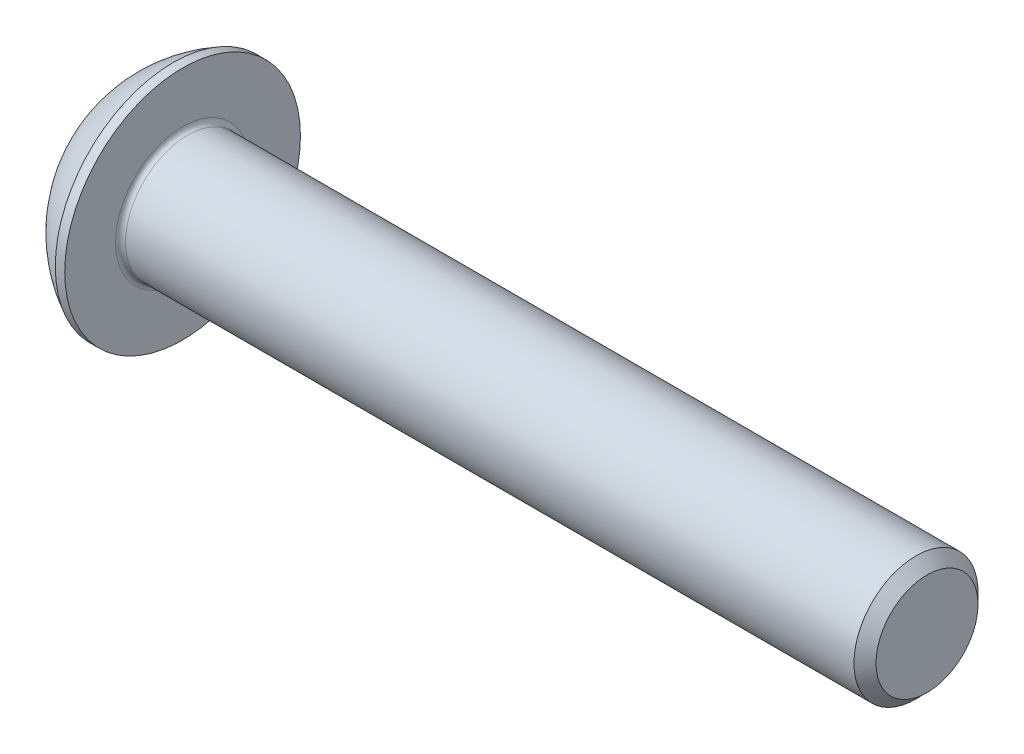
ISO-10303-21;
HEADER;
FILE_DESCRIPTION(('STEP AP214'),'2;1');
FILE_NAME('part.step','',(''),(''),'','','');
FILE_SCHEMA(('AUTOMOTIVE_DESIGN { 1 0 10303 214 1 1 1 1 }'));
ENDSEC;
DATA;
#1=APPLICATION_CONTEXT('core data for automotive mechanical design processes');
#2=APPLICATION_PROTOCOL_DEFINITION('international standard','automotive_design',2000,#1);
#3=PRODUCT_CONTEXT('',#1,'mechanical');
#4=PRODUCT('Part','Part','',(#3));
#5=PRODUCT_RELATED_PRODUCT_CATEGORY('part','',(#4));
#6=PRODUCT_DEFINITION_FORMATION('','',#4);
#7=PRODUCT_DEFINITION_CONTEXT('part definition',#1,'design');
#8=PRODUCT_DEFINITION('design','',#6,#7);
#9=PRODUCT_DEFINITION_SHAPE('','',#8);
#10=(LENGTH_UNIT() NAMED_UNIT(*) SI_UNIT(.MILLI.,.METRE.));
#11=(NAMED_UNIT(*) PLANE_ANGLE_UNIT() SI_UNIT($,.RADIAN.));
#12=(NAMED_UNIT(*) SI_UNIT($,.STERADIAN.) SOLID_ANGLE_UNIT());
#13=UNCERTAINTY_MEASURE_WITH_UNIT(LENGTH_MEASURE(1.E-05),#10,'distance_accuracy_value','');
#14=(GEOMETRIC_REPRESENTATION_CONTEXT(3) GLOBAL_UNCERTAINTY_ASSIGNED_CONTEXT((#13)) GLOBAL_UNIT_ASSIGNED_CONTEXT((#10,
#11,#12)) REPRESENTATION_CONTEXT('',''));
#15=CARTESIAN_POINT('',(0.,0.,0.));
#16=DIRECTION('',(0.,0.,1.));
#17=DIRECTION('',(1.,0.,0.));
#18=AXIS2_PLACEMENT_3D('',#15,#16,#17);
#19=CARTESIAN_POINT('',(0.,0.,0.));
#20=DIRECTION('',(-1.,0.,0.));
#21=DIRECTION('',(0.,0.,1.));
#22=AXIS2_PLACEMENT_3D('',#19,#20,#21);
#23=PLANE('',#22);
#24=CARTESIAN_POINT('',(0.,0.,0.));
#25=DIRECTION('',(-1.,0.,0.));
#26=DIRECTION('',(0.,0.,1.));
#27=AXIS2_PLACEMENT_3D('',#24,#25,#26);
#28=CIRCLE('',#27,2.375);
#29=CARTESIAN_POINT('',(0.,2.375,0.));
#30=VERTEX_POINT('',#29);
#31=EDGE_CURVE('E157',#30,#30,#28,.T.);
#32=ORIENTED_EDGE('',*,*,#31,.T.);
#33=EDGE_LOOP('',(#32));
#34=FACE_BOUND('',#33,.T.);
#35=DIRECTION('',(0.,-1.,0.));
#36=VECTOR('',#35,1.);
#37=CARTESIAN_POINT('',(0.,-0.866025403784438,1.5));
#38=LINE('',#37,#36);
#39=CARTESIAN_POINT('',(0.,0.866025403784439,1.5));
#40=VERTEX_POINT('',#39);
#41=CARTESIAN_POINT('',(0.,-0.866025403784438,1.5));
#42=VERTEX_POINT('',#41);
#43=EDGE_CURVE('E52',#40,#42,#38,.T.);
#44=ORIENTED_EDGE('',*,*,#43,.T.);
#45=DIRECTION('',(0.,-0.500000000000001,-0.866025403784438));
#46=VECTOR('',#45,1.);
#47=CARTESIAN_POINT('',(0.,-1.73205080756888,0.));
#48=LINE('',#47,#46);
#49=CARTESIAN_POINT('',(0.,-1.73205080756888,0.));
#50=VERTEX_POINT('',#49);
#51=EDGE_CURVE('E277',#42,#50,#48,.T.);
#52=ORIENTED_EDGE('',*,*,#51,.T.);
#53=DIRECTION('',(0.,0.500000000000001,-0.866025403784438));
#54=VECTOR('',#53,1.);
#55=CARTESIAN_POINT('',(0.,-0.866025403784438,-1.5));
#56=LINE('',#55,#54);
#57=CARTESIAN_POINT('',(0.,-0.866025403784438,-1.5));
#58=VERTEX_POINT('',#57);
#59=EDGE_CURVE('E132',#50,#58,#56,.T.);
#60=ORIENTED_EDGE('',*,*,#59,.T.);
#61=DIRECTION('',(0.,1.,0.));
#62=VECTOR('',#61,1.);
#63=CARTESIAN_POINT('',(0.,0.866025403784439,-1.5));
#64=LINE('',#63,#62);
#65=CARTESIAN_POINT('',(0.,0.866025403784439,-1.5));
#66=VERTEX_POINT('',#65);
#67=EDGE_CURVE('E280',#58,#66,#64,.T.);
#68=ORIENTED_EDGE('',*,*,#67,.T.);
#69=DIRECTION('',(0.,0.5,0.866025403784439));
#70=VECTOR('',#69,1.);
#71=CARTESIAN_POINT('',(0.,1.73205080756888,0.));
#72=LINE('',#71,#70);
#73=CARTESIAN_POINT('',(0.,1.73205080756888,0.));
#74=VERTEX_POINT('',#73);
#75=EDGE_CURVE('E282',#66,#74,#72,.T.);
#76=ORIENTED_EDGE('',*,*,#75,.T.);
#77=DIRECTION('',(0.,-0.5,0.866025403784439));
#78=VECTOR('',#77,1.);
#79=CARTESIAN_POINT('',(0.,0.866025403784439,1.5));
#80=LINE('',#79,#78);
#81=EDGE_CURVE('E284',#74,#40,#80,.T.);
#82=ORIENTED_EDGE('',*,*,#81,.T.);
#83=EDGE_LOOP('',(#44,#52,#60,#68,#76,#82));
#84=FACE_BOUND('',#83,.T.);
#85=ADVANCED_FACE('F37',(#34,#84),#23,.T.);
#86=CARTESIAN_POINT('',(4.75501582278481,0.,0.));
#87=DIRECTION('',(-1.,0.,0.));
#88=DIRECTION('',(0.,1.,0.));
#89=AXIS2_PLACEMENT_3D('',#86,#87,#88);
#90=SPHERICAL_SURFACE('',#89,5.3151482081814);
#91=CARTESIAN_POINT('',(2.37,0.,0.));
#92=DIRECTION('',(-1.,0.,0.));
#93=DIRECTION('',(0.,0.,1.));
#94=AXIS2_PLACEMENT_3D('',#91,#92,#93);
#95=CIRCLE('',#94,4.75);
#96=CARTESIAN_POINT('',(2.37,4.75,0.));
#97=VERTEX_POINT('',#96);
#98=EDGE_CURVE('E154',#97,#97,#95,.T.);
#99=CARTESIAN_POINT('',(2.37,4.75,0.));
#100=CARTESIAN_POINT('',(2.33822259048669,4.73404434732511,0.));
#101=CARTESIAN_POINT('',(2.30660534291523,4.71776971995817,0.));
#102=CARTESIAN_POINT('',(2.24370380094997,4.68458927158339,0.));
#103=CARTESIAN_POINT('',(2.21241950655618,4.66768345057555,0.));
#104=CARTESIAN_POINT('',(2.15019650024021,4.6332473706621,0.));
#105=CARTESIAN_POINT('',(2.11925778831804,4.6157171117565,0.));
#106=CARTESIAN_POINT('',(2.05773840110808,4.58003923142985,0.));
#107=CARTESIAN_POINT('',(2.02715772582028,4.56189161000879,0.));
#108=CARTESIAN_POINT('',(1.96636673145741,4.52498631044657,0.));
#109=CARTESIAN_POINT('',(1.93615641238234,4.50622863230542,0.));
#110=CARTESIAN_POINT('',(1.87611829826807,4.46811077571318,0.));
#111=CARTESIAN_POINT('',(1.84629050322887,4.4487505972621,0.));
#112=CARTESIAN_POINT('',(1.78702945162455,4.40943553782984,0.));
#113=CARTESIAN_POINT('',(1.75759619505941,4.38948065684866,0.));
#114=CARTESIAN_POINT('',(1.69913607574061,4.34898423002648,0.));
#115=CARTESIAN_POINT('',(1.67010921298694,4.32844268418549,0.));
#116=CARTESIAN_POINT('',(1.61247357298735,4.28678120152175,0.));
#117=CARTESIAN_POINT('',(1.58386479574144,4.265661264699,0.));
#118=CARTESIAN_POINT('',(1.52707685004032,4.22285150694424,0.));
#119=CARTESIAN_POINT('',(1.49889768158512,4.20116168601223,0.));
#120=CARTESIAN_POINT('',(1.44298030371049,4.15722089644741,0.));
#121=CARTESIAN_POINT('',(1.41524209429107,4.13496992781461,0.));
#122=CARTESIAN_POINT('',(1.36021780711889,4.08991580528235,0.));
#123=CARTESIAN_POINT('',(1.33293172936613,4.06711265138288,0.));
#124=CARTESIAN_POINT('',(1.278822696045,4.02096334316478,0.));
#125=CARTESIAN_POINT('',(1.25199974047662,3.99761718884614,0.));
#126=CARTESIAN_POINT('',(1.19882775550162,3.95039128335163,0.));
#127=CARTESIAN_POINT('',(1.172478726095,3.92651153217576,0.));
#128=CARTESIAN_POINT('',(1.1202652065289,3.87822805145535,0.));
#129=CARTESIAN_POINT('',(1.09440071636942,3.85382432191081,0.));
#130=CARTESIAN_POINT('',(1.04316669321618,3.8045027139941,0.));
#131=CARTESIAN_POINT('',(1.01779716022241,3.77958483562192,0.));
#132=CARTESIAN_POINT('',(0.9675632699561,3.72924496668416,0.));
#133=CARTESIAN_POINT('',(0.942698912683562,3.70382297611859,0.));
#134=CARTESIAN_POINT('',(0.893485388936279,3.65248512247887,0.));
#135=CARTESIAN_POINT('',(0.869136222461535,3.62656925940472,0.));
#136=CARTESIAN_POINT('',(0.820962887873489,3.57425409935885,0.));
#137=CARTESIAN_POINT('',(0.797138719760188,3.54785480238711,0.));
#138=CARTESIAN_POINT('',(0.750024977995378,3.49458340787865,0.));
#139=CARTESIAN_POINT('',(0.726735404343869,3.46771131034191,0.));
#140=CARTESIAN_POINT('',(0.68070023227454,3.41350513847464,0.));
#141=CARTESIAN_POINT('',(0.657954633856721,3.3861710641441,0.));
#142=CARTESIAN_POINT('',(0.613016573919582,3.33105194853939,0.));
#143=CARTESIAN_POINT('',(0.590824112400263,3.30326690726522,0.));
#144=CARTESIAN_POINT('',(0.547001265128254,3.24725704926748,0.));
#145=CARTESIAN_POINT('',(0.525370879375564,3.21903223254391,0.));
#146=CARTESIAN_POINT('',(0.482680896105488,3.16215419227902,0.));
#147=CARTESIAN_POINT('',(0.461621298588104,3.13350096873769,0.));
#148=CARTESIAN_POINT('',(0.420081374357153,3.07577765602273,0.));
#149=CARTESIAN_POINT('',(0.399601047643587,3.04670756684908,0.));
#150=CARTESIAN_POINT('',(0.359227914239947,2.98816223197683,0.));
#151=CARTESIAN_POINT('',(0.339335107549873,2.95868698627822,0.));
#152=CARTESIAN_POINT('',(0.300145026860787,2.89934321060632,0.));
#153=CARTESIAN_POINT('',(0.280847752861776,2.86947468063304,0.));
#154=CARTESIAN_POINT('',(0.24285650999714,2.80935636725696,0.));
#155=CARTESIAN_POINT('',(0.224162541131515,2.77910658385417,0.));
#156=CARTESIAN_POINT('',(0.187385439283607,2.71823794734018,0.));
#157=CARTESIAN_POINT('',(0.169302306301324,2.68761909422898,0.));
#158=CARTESIAN_POINT('',(0.133754156035988,2.626024653246,0.));
#159=CARTESIAN_POINT('',(0.116289138752934,2.59504906537422,0.));
#160=CARTESIAN_POINT('',(0.081984269005742,2.53275362391635,0.));
#161=CARTESIAN_POINT('',(0.0651444165416036,2.50143377033028,0.));
#162=CARTESIAN_POINT('',(0.0320966055444289,2.43846244094735,0.));
#163=CARTESIAN_POINT('',(0.0158886470113927,2.40681096515049,0.));
#164=CARTESIAN_POINT('',(0.,2.375,0.));
#165=B_SPLINE_CURVE_WITH_KNOTS('',3,(#99,#100,#101,#102,#103,#104,#105,#106,#107,#108,#109,#110,
#111,#112,#113,#114,#115,#116,#117,#118,#119,#120,#121,#122,#123,#124,#125,#126,#127,#128,#129,
#130,#131,#132,#133,#134,#135,#136,#137,#138,#139,#140,#141,#142,#143,#144,#145,#146,#147,#148,
#149,#150,#151,#152,#153,#154,#155,#156,#157,#158,#159,#160,#161,#162,#163,#164),.UNSPECIFIED.,
.F.,.F.,(4,2,2,2,2,2,2,2,2,2,2,2,2,2,2,2,2,2,2,2,2,2,2,2,2,2,2,2,2,2,2,2,4),(0.,
0.106672849678272,0.213345699356545,0.320018549034817,0.42669139871309,0.533364248391363,
0.640037098069635,0.746709947747908,0.85338279742618,0.960055647104452,1.06672849678273,
1.173401346461,1.28007419613927,1.38674704581754,1.49341989549582,1.60009274517409,
1.70676559485236,1.81343844453063,1.9201112942089,2.02678414388718,2.13345699356545,
2.24012984324372,2.346802692922,2.45347554260027,2.56014839227854,2.66682124195681,
2.77349409163509,2.88016694131336,2.98683979099163,3.0935126406699,3.20018549034817,
3.30685834002645,3.41353118970472),.UNSPECIFIED.);
#166=EDGE_CURVE('BSEAM178',#97,#30,#165,.T.);
#167=ORIENTED_EDGE('',*,*,#98,.T.);
#168=ORIENTED_EDGE('',*,*,#31,.F.);
#169=ORIENTED_EDGE('',*,*,#166,.T.);
#170=ORIENTED_EDGE('',*,*,#166,.F.);
#171=EDGE_LOOP('',(#167,#169,#168,#170));
#172=FACE_BOUND('',#171,.T.);
#173=ADVANCED_FACE('F178',(#172),#90,.T.);
#174=CARTESIAN_POINT('',(0.,0.,0.));
#175=DIRECTION('',(-1.,0.,0.));
#176=DIRECTION('',(0.,0.,1.));
#177=AXIS2_PLACEMENT_3D('',#174,#175,#176);
#178=CYLINDRICAL_SURFACE('',#177,4.75);
#179=ORIENTED_EDGE('',*,*,#98,.F.);
#180=EDGE_LOOP('',(#179));
#181=FACE_BOUND('',#180,.T.);
#182=CARTESIAN_POINT('',(2.75,0.,0.));
#183=DIRECTION('',(-1.,0.,0.));
#184=DIRECTION('',(0.,0.,1.));
#185=AXIS2_PLACEMENT_3D('',#182,#183,#184);
#186=CIRCLE('',#185,4.75);
#187=CARTESIAN_POINT('',(2.75,0.,4.75));
#188=VERTEX_POINT('',#187);
#189=EDGE_CURVE('E151',#188,#188,#186,.T.);
#190=ORIENTED_EDGE('',*,*,#189,.T.);
#191=EDGE_LOOP('',(#190));
#192=FACE_BOUND('',#191,.T.);
#193=ADVANCED_FACE('F183',(#181,#192),#178,.T.);
#194=CARTESIAN_POINT('',(2.75,2.5,0.));
#195=DIRECTION('',(-1.,0.,0.));
#196=DIRECTION('',(0.,0.,1.));
#197=AXIS2_PLACEMENT_3D('',#194,#195,#196);
#198=PLANE('',#197);
#199=CARTESIAN_POINT('',(2.75,0.,0.));
#200=DIRECTION('',(-1.,0.,0.));
#201=DIRECTION('',(0.,0.,1.));
#202=AXIS2_PLACEMENT_3D('',#199,#200,#201);
#203=CIRCLE('',#202,2.7);
#204=CARTESIAN_POINT('',(2.75,0.,2.7));
#205=VERTEX_POINT('',#204);
#206=EDGE_CURVE('E45',#205,#205,#203,.T.);
#207=ORIENTED_EDGE('',*,*,#206,.T.);
#208=EDGE_LOOP('',(#207));
#209=FACE_BOUND('',#208,.T.);
#210=ORIENTED_EDGE('',*,*,#189,.F.);
#211=EDGE_LOOP('',(#210));
#212=FACE_BOUND('',#211,.T.);
#213=ADVANCED_FACE('F162',(#209,#212),#198,.F.);
#214=CARTESIAN_POINT('',(0.,0.,0.));
#215=DIRECTION('',(-1.,0.,0.));
#216=DIRECTION('',(0.,0.,1.));
#217=AXIS2_PLACEMENT_3D('',#214,#215,#216);
#218=CYLINDRICAL_SURFACE('',#217,2.5);
#219=CARTESIAN_POINT('',(2.95,0.,0.));
#220=DIRECTION('',(-1.,0.,0.));
#221=DIRECTION('',(0.,0.,1.));
#222=AXIS2_PLACEMENT_3D('',#219,#220,#221);
#223=CIRCLE('',#222,2.5);
#224=CARTESIAN_POINT('',(2.95,0.,2.5));
#225=VERTEX_POINT('',#224);
#226=EDGE_CURVE('E11',#225,#225,#223,.F.);
#227=ORIENTED_EDGE('',*,*,#226,.T.);
#228=EDGE_LOOP('',(#227));
#229=FACE_BOUND('',#228,.T.);
#230=CARTESIAN_POINT('',(32.305,0.,0.));
#231=DIRECTION('',(-1.,0.,0.));
#232=DIRECTION('',(0.,0.,1.));
#233=AXIS2_PLACEMENT_3D('',#230,#231,#232);
#234=CIRCLE('',#233,2.5);
#235=CARTESIAN_POINT('',(32.305,0.,2.5));
#236=VERTEX_POINT('',#235);
#237=EDGE_CURVE('E148',#236,#236,#234,.T.);
#238=ORIENTED_EDGE('',*,*,#237,.T.);
#239=EDGE_LOOP('',(#238));
#240=FACE_BOUND('',#239,.T.);
#241=ADVANCED_FACE('F192',(#229,#240),#218,.T.);
#242=CARTESIAN_POINT('',(32.75,0.,0.));
#243=DIRECTION('',(-1.,0.,0.));
#244=DIRECTION('',(0.,0.,1.));
#245=AXIS2_PLACEMENT_3D('',#242,#243,#244);
#246=CONICAL_SURFACE('',#245,2.055,0.78539816339744);
#247=ORIENTED_EDGE('',*,*,#237,.F.);
#248=EDGE_LOOP('',(#247));
#249=FACE_BOUND('',#248,.T.);
#250=CARTESIAN_POINT('',(32.75,0.,0.));
#251=DIRECTION('',(-1.,0.,0.));
#252=DIRECTION('',(0.,0.,1.));
#253=AXIS2_PLACEMENT_3D('',#250,#251,#252);
#254=CIRCLE('',#253,2.055);
#255=CARTESIAN_POINT('',(32.75,0.,2.055));
#256=VERTEX_POINT('',#255);
#257=EDGE_CURVE('E144',#256,#256,#254,.T.);
#258=ORIENTED_EDGE('',*,*,#257,.T.);
#259=EDGE_LOOP('',(#258));
#260=FACE_BOUND('',#259,.T.);
#261=ADVANCED_FACE('F173',(#249,#260),#246,.T.);
#262=CARTESIAN_POINT('',(32.75,0.,0.));
#263=DIRECTION('',(-1.,0.,0.));
#264=DIRECTION('',(0.,0.,1.));
#265=AXIS2_PLACEMENT_3D('',#262,#263,#264);
#266=PLANE('',#265);
#267=ORIENTED_EDGE('',*,*,#257,.F.);
#268=EDGE_LOOP('',(#267));
#269=FACE_BOUND('',#268,.T.);
#270=ADVANCED_FACE('F166',(#269),#266,.F.);
#271=CARTESIAN_POINT('',(2.95,0.,0.));
#272=DIRECTION('',(-1.,0.,0.));
#273=DIRECTION('',(0.,0.,1.));
#274=AXIS2_PLACEMENT_3D('',#271,#272,#273);
#275=TOROIDAL_SURFACE('',#274,2.7,0.2);
#276=ORIENTED_EDGE('',*,*,#226,.F.);
#277=EDGE_LOOP('',(#276));
#278=FACE_BOUND('',#277,.T.);
#279=ORIENTED_EDGE('',*,*,#206,.F.);
#280=EDGE_LOOP('',(#279));
#281=FACE_BOUND('',#280,.T.);
#282=ADVANCED_FACE('F39',(#278,#281),#275,.F.);
#283=CARTESIAN_POINT('',(1.56,-1.73205080756888,0.));
#284=DIRECTION('',(0.,0.866025403784438,-0.500000000000001));
#285=DIRECTION('',(0.,0.500000000000001,0.866025403784438));
#286=AXIS2_PLACEMENT_3D('',#283,#284,#285);
#287=PLANE('',#286);
#288=DIRECTION('',(0.,-0.500000000000001,-0.866025403784438));
#289=VECTOR('',#288,1.);
#290=CARTESIAN_POINT('',(1.56,-1.73205080756888,0.));
#291=LINE('',#290,#289);
#292=CARTESIAN_POINT('',(1.56,-0.866025403784438,1.5));
#293=VERTEX_POINT('',#292);
#294=CARTESIAN_POINT('',(1.56,-1.29903810567666,0.750000000000002));
#295=VERTEX_POINT('',#294);
#296=EDGE_CURVE('E118',#293,#295,#291,.T.);
#297=ORIENTED_EDGE('',*,*,#296,.T.);
#298=CARTESIAN_POINT('',(1.56,-1.73205080756888,0.));
#299=VERTEX_POINT('',#298);
#300=EDGE_CURVE('E113',#295,#299,#291,.T.);
#301=ORIENTED_EDGE('',*,*,#300,.T.);
#302=DIRECTION('',(-1.,0.,0.));
#303=VECTOR('',#302,1.);
#304=CARTESIAN_POINT('',(1.56,-1.73205080756888,0.));
#305=LINE('',#304,#303);
#306=EDGE_CURVE('E115',#299,#50,#305,.T.);
#307=ORIENTED_EDGE('',*,*,#306,.T.);
#308=ORIENTED_EDGE('',*,*,#51,.F.);
#309=DIRECTION('',(-1.,0.,0.));
#310=VECTOR('',#309,1.);
#311=CARTESIAN_POINT('',(1.56,-0.866025403784438,1.5));
#312=LINE('',#311,#310);
#313=EDGE_CURVE('E273',#293,#42,#312,.T.);
#314=ORIENTED_EDGE('',*,*,#313,.F.);
#315=EDGE_LOOP('',(#297,#301,#307,#308,#314));
#316=FACE_BOUND('',#315,.T.);
#317=ADVANCED_FACE('F114',(#316),#287,.T.);
#318=CARTESIAN_POINT('',(1.56,-0.866025403784438,-1.5));
#319=DIRECTION('',(0.,0.866025403784438,0.500000000000001));
#320=DIRECTION('',(0.,-0.500000000000001,0.866025403784438));
#321=AXIS2_PLACEMENT_3D('',#318,#319,#320);
#322=PLANE('',#321);
#323=DIRECTION('',(0.,0.500000000000001,-0.866025403784438));
#324=VECTOR('',#323,1.);
#325=CARTESIAN_POINT('',(1.56,-0.866025403784438,-1.5));
#326=LINE('',#325,#324);
#327=CARTESIAN_POINT('',(1.56,-1.29903810567666,-0.750000000000001));
#328=VERTEX_POINT('',#327);
#329=EDGE_CURVE('E60',#299,#328,#326,.T.);
#330=ORIENTED_EDGE('',*,*,#329,.T.);
#331=CARTESIAN_POINT('',(1.56,-0.866025403784438,-1.5));
#332=VERTEX_POINT('',#331);
#333=EDGE_CURVE('E127',#328,#332,#326,.T.);
#334=ORIENTED_EDGE('',*,*,#333,.T.);
#335=DIRECTION('',(-1.,0.,0.));
#336=VECTOR('',#335,1.);
#337=CARTESIAN_POINT('',(1.56,-0.866025403784438,-1.5));
#338=LINE('',#337,#336);
#339=EDGE_CURVE('E134',#332,#58,#338,.T.);
#340=ORIENTED_EDGE('',*,*,#339,.T.);
#341=ORIENTED_EDGE('',*,*,#59,.F.);
#342=ORIENTED_EDGE('',*,*,#306,.F.);
#343=EDGE_LOOP('',(#330,#334,#340,#341,#342));
#344=FACE_BOUND('',#343,.T.);
#345=ADVANCED_FACE('F130',(#344),#322,.T.);
#346=CARTESIAN_POINT('',(1.56,0.866025403784439,-1.5));
#347=DIRECTION('',(0.,0.,1.));
#348=DIRECTION('',(1.,0.,0.));
#349=AXIS2_PLACEMENT_3D('',#346,#347,#348);
#350=PLANE('',#349);
#351=DIRECTION('',(0.,1.,0.));
#352=VECTOR('',#351,1.);
#353=CARTESIAN_POINT('',(1.56,0.866025403784439,-1.5));
#354=LINE('',#353,#352);
#355=CARTESIAN_POINT('',(1.56,0.,-1.5));
#356=VERTEX_POINT('',#355);
#357=EDGE_CURVE('E254',#332,#356,#354,.T.);
#358=ORIENTED_EDGE('',*,*,#357,.T.);
#359=CARTESIAN_POINT('',(1.56,0.866025403784439,-1.5));
#360=VERTEX_POINT('',#359);
#361=EDGE_CURVE('E126',#356,#360,#354,.T.);
#362=ORIENTED_EDGE('',*,*,#361,.T.);
#363=DIRECTION('',(-1.,0.,0.));
#364=VECTOR('',#363,1.);
#365=CARTESIAN_POINT('',(1.56,0.866025403784439,-1.5));
#366=LINE('',#365,#364);
#367=EDGE_CURVE('E139',#360,#66,#366,.T.);
#368=ORIENTED_EDGE('',*,*,#367,.T.);
#369=ORIENTED_EDGE('',*,*,#67,.F.);
#370=ORIENTED_EDGE('',*,*,#339,.F.);
#371=EDGE_LOOP('',(#358,#362,#368,#369,#370));
#372=FACE_BOUND('',#371,.T.);
#373=ADVANCED_FACE('F206',(#372),#350,.T.);
#374=CARTESIAN_POINT('',(1.56,1.73205080756888,0.));
#375=DIRECTION('',(0.,-0.866025403784439,0.5));
#376=DIRECTION('',(0.,-0.5,-0.866025403784439));
#377=AXIS2_PLACEMENT_3D('',#374,#375,#376);
#378=PLANE('',#377);
#379=DIRECTION('',(0.,0.5,0.866025403784439));
#380=VECTOR('',#379,1.);
#381=CARTESIAN_POINT('',(1.56,1.73205080756888,0.));
#382=LINE('',#381,#380);
#383=CARTESIAN_POINT('',(1.56,1.29903810567666,-0.75));
#384=VERTEX_POINT('',#383);
#385=EDGE_CURVE('E243',#360,#384,#382,.T.);
#386=ORIENTED_EDGE('',*,*,#385,.T.);
#387=CARTESIAN_POINT('',(1.56,1.73205080756888,0.));
#388=VERTEX_POINT('',#387);
#389=EDGE_CURVE('E248',#384,#388,#382,.T.);
#390=ORIENTED_EDGE('',*,*,#389,.T.);
#391=DIRECTION('',(-1.,0.,0.));
#392=VECTOR('',#391,1.);
#393=CARTESIAN_POINT('',(1.56,1.73205080756888,0.));
#394=LINE('',#393,#392);
#395=EDGE_CURVE('E288',#388,#74,#394,.T.);
#396=ORIENTED_EDGE('',*,*,#395,.T.);
#397=ORIENTED_EDGE('',*,*,#75,.F.);
#398=ORIENTED_EDGE('',*,*,#367,.F.);
#399=EDGE_LOOP('',(#386,#390,#396,#397,#398));
#400=FACE_BOUND('',#399,.T.);
#401=ADVANCED_FACE('F209',(#400),#378,.T.);
#402=CARTESIAN_POINT('',(1.56,0.866025403784439,1.5));
#403=DIRECTION('',(0.,-0.866025403784439,-0.5));
#404=DIRECTION('',(0.,0.5,-0.866025403784439));
#405=AXIS2_PLACEMENT_3D('',#402,#403,#404);
#406=PLANE('',#405);
#407=DIRECTION('',(0.,-0.5,0.866025403784439));
#408=VECTOR('',#407,1.);
#409=CARTESIAN_POINT('',(1.56,0.866025403784439,1.5));
#410=LINE('',#409,#408);
#411=CARTESIAN_POINT('',(1.56,1.29903810567666,0.75));
#412=VERTEX_POINT('',#411);
#413=EDGE_CURVE('E251',#388,#412,#410,.T.);
#414=ORIENTED_EDGE('',*,*,#413,.T.);
#415=CARTESIAN_POINT('',(1.56,0.866025403784439,1.5));
#416=VERTEX_POINT('',#415);
#417=EDGE_CURVE('E259',#412,#416,#410,.T.);
#418=ORIENTED_EDGE('',*,*,#417,.T.);
#419=DIRECTION('',(-1.,0.,0.));
#420=VECTOR('',#419,1.);
#421=CARTESIAN_POINT('',(1.56,0.866025403784439,1.5));
#422=LINE('',#421,#420);
#423=EDGE_CURVE('E272',#416,#40,#422,.T.);
#424=ORIENTED_EDGE('',*,*,#423,.T.);
#425=ORIENTED_EDGE('',*,*,#81,.F.);
#426=ORIENTED_EDGE('',*,*,#395,.F.);
#427=EDGE_LOOP('',(#414,#418,#424,#425,#426));
#428=FACE_BOUND('',#427,.T.);
#429=ADVANCED_FACE('F213',(#428),#406,.T.);
#430=CARTESIAN_POINT('',(1.56,-0.866025403784438,1.5));
#431=DIRECTION('',(0.,0.,-1.));
#432=DIRECTION('',(-1.,0.,0.));
#433=AXIS2_PLACEMENT_3D('',#430,#431,#432);
#434=PLANE('',#433);
#435=DIRECTION('',(0.,-1.,0.));
#436=VECTOR('',#435,1.);
#437=CARTESIAN_POINT('',(1.56,-0.866025403784438,1.5));
#438=LINE('',#437,#436);
#439=CARTESIAN_POINT('',(1.56,0.,1.5));
#440=VERTEX_POINT('',#439);
#441=EDGE_CURVE('E265',#416,#440,#438,.T.);
#442=ORIENTED_EDGE('',*,*,#441,.T.);
#443=EDGE_CURVE('E267',#440,#293,#438,.T.);
#444=ORIENTED_EDGE('',*,*,#443,.T.);
#445=ORIENTED_EDGE('',*,*,#313,.T.);
#446=ORIENTED_EDGE('',*,*,#43,.F.);
#447=ORIENTED_EDGE('',*,*,#423,.F.);
#448=EDGE_LOOP('',(#442,#444,#445,#446,#447));
#449=FACE_BOUND('',#448,.T.);
#450=ADVANCED_FACE('F217',(#449),#434,.T.);
#451=CARTESIAN_POINT('',(1.56,-1.73205080756888,0.));
#452=DIRECTION('',(1.,0.,0.));
#453=DIRECTION('',(0.,0.,-1.));
#454=AXIS2_PLACEMENT_3D('',#451,#452,#453);
#455=PLANE('',#454);
#456=CARTESIAN_POINT('',(1.56,0.,0.));
#457=DIRECTION('',(-1.,0.,0.));
#458=DIRECTION('',(0.,0.,1.));
#459=AXIS2_PLACEMENT_3D('',#456,#457,#458);
#460=CIRCLE('',#459,1.5);
#461=EDGE_CURVE('E240',#384,#356,#460,.T.);
#462=ORIENTED_EDGE('',*,*,#461,.F.);
#463=ORIENTED_EDGE('',*,*,#385,.F.);
#464=ORIENTED_EDGE('',*,*,#361,.F.);
#465=EDGE_LOOP('',(#462,#463,#464));
#466=FACE_BOUND('',#465,.T.);
#467=ADVANCED_FACE('F221',(#466),#455,.F.);
#468=EDGE_CURVE('E145',#412,#384,#460,.T.);
#469=ORIENTED_EDGE('',*,*,#468,.F.);
#470=ORIENTED_EDGE('',*,*,#413,.F.);
#471=ORIENTED_EDGE('',*,*,#389,.F.);
#472=EDGE_LOOP('',(#469,#470,#471));
#473=FACE_BOUND('',#472,.T.);
#474=ADVANCED_FACE('F230',(#473),#455,.F.);
#475=EDGE_CURVE('E138',#440,#412,#460,.T.);
#476=ORIENTED_EDGE('',*,*,#475,.F.);
#477=ORIENTED_EDGE('',*,*,#441,.F.);
#478=ORIENTED_EDGE('',*,*,#417,.F.);
#479=EDGE_LOOP('',(#476,#477,#478));
#480=FACE_BOUND('',#479,.T.);
#481=ADVANCED_FACE('F235',(#480),#455,.F.);
#482=EDGE_CURVE('E133',#295,#440,#460,.T.);
#483=ORIENTED_EDGE('',*,*,#482,.F.);
#484=ORIENTED_EDGE('',*,*,#296,.F.);
#485=ORIENTED_EDGE('',*,*,#443,.F.);
#486=EDGE_LOOP('',(#483,#484,#485));
#487=FACE_BOUND('',#486,.T.);
#488=ADVANCED_FACE('F228',(#487),#455,.F.);
#489=EDGE_CURVE('E124',#328,#295,#460,.T.);
#490=ORIENTED_EDGE('',*,*,#489,.F.);
#491=ORIENTED_EDGE('',*,*,#329,.F.);
#492=ORIENTED_EDGE('',*,*,#300,.F.);
#493=EDGE_LOOP('',(#490,#491,#492));
#494=FACE_BOUND('',#493,.T.);
#495=ADVANCED_FACE('F123',(#494),#455,.F.);
#496=EDGE_CURVE('E246',#356,#328,#460,.T.);
#497=ORIENTED_EDGE('',*,*,#496,.F.);
#498=ORIENTED_EDGE('',*,*,#357,.F.);
#499=ORIENTED_EDGE('',*,*,#333,.F.);
#500=EDGE_LOOP('',(#497,#498,#499));
#501=FACE_BOUND('',#500,.T.);
#502=ADVANCED_FACE('F201',(#501),#455,.F.);
#503=CARTESIAN_POINT('',(2.42602540378445,0.,0.));
#504=DIRECTION('',(-1.,0.,0.));
#505=DIRECTION('',(0.,0.,1.));
#506=AXIS2_PLACEMENT_3D('',#503,#504,#505);
#507=CONICAL_SURFACE('',#506,0.,1.04719755119659);
#508=ORIENTED_EDGE('',*,*,#475,.T.);
#509=ORIENTED_EDGE('',*,*,#468,.T.);
#510=ORIENTED_EDGE('',*,*,#461,.T.);
#511=ORIENTED_EDGE('',*,*,#496,.T.);
#512=ORIENTED_EDGE('',*,*,#489,.T.);
#513=ORIENTED_EDGE('',*,*,#482,.T.);
#514=EDGE_LOOP('',(#508,#509,#510,#511,#512,#513));
#515=FACE_BOUND('',#514,.T.);
#516=CARTESIAN_POINT('',(2.42602540378445,0.,0.));
#517=VERTEX_POINT('',#516);
#518=VERTEX_LOOP('',#517);
#519=FACE_BOUND('',#518,.T.);
#520=ADVANCED_FACE('F199',(#515,#519),#507,.F.);
#521=CLOSED_SHELL('',(#85,#173,#193,#213,#241,#261,#270,#282,#317,#345,#373,#401,#429,#450,#467,
#474,#481,#488,#495,#502,#520));
#522=MANIFOLD_SOLID_BREP('B2',#521);
#523=ADVANCED_BREP_SHAPE_REPRESENTATION('',(#18,#522),#14);
#524=SHAPE_DEFINITION_REPRESENTATION(#9,#523);
ENDSEC;
END-ISO-10303-21;
